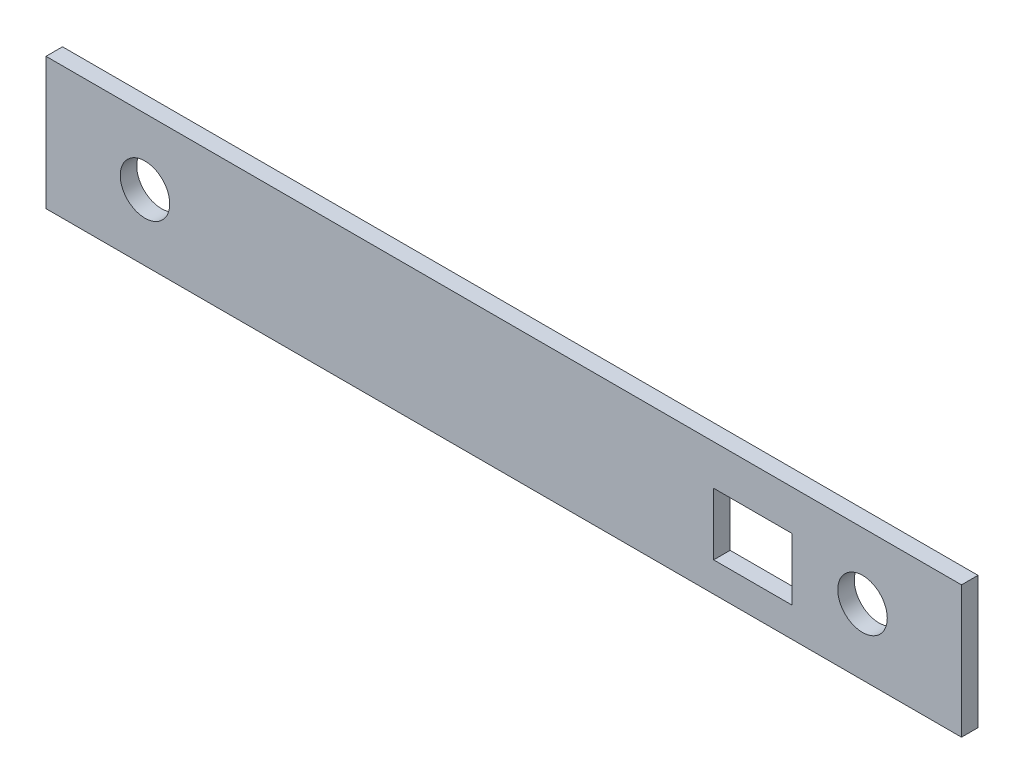
ISO-10303-21;
HEADER;
FILE_DESCRIPTION(('STEP AP214'),'2;1');
FILE_NAME('part.step','',(''),(''),'','','');
FILE_SCHEMA(('AUTOMOTIVE_DESIGN { 1 0 10303 214 1 1 1 1 }'));
ENDSEC;
DATA;
#1=APPLICATION_CONTEXT('core data for automotive mechanical design processes');
#2=APPLICATION_PROTOCOL_DEFINITION('international standard','automotive_design',2000,#1);
#3=PRODUCT_CONTEXT('',#1,'mechanical');
#4=PRODUCT('Part','Part','',(#3));
#5=PRODUCT_RELATED_PRODUCT_CATEGORY('part','',(#4));
#6=PRODUCT_DEFINITION_FORMATION('','',#4);
#7=PRODUCT_DEFINITION_CONTEXT('part definition',#1,'design');
#8=PRODUCT_DEFINITION('design','',#6,#7);
#9=PRODUCT_DEFINITION_SHAPE('','',#8);
#10=(LENGTH_UNIT() NAMED_UNIT(*) SI_UNIT(.MILLI.,.METRE.));
#11=(NAMED_UNIT(*) PLANE_ANGLE_UNIT() SI_UNIT($,.RADIAN.));
#12=(NAMED_UNIT(*) SI_UNIT($,.STERADIAN.) SOLID_ANGLE_UNIT());
#13=UNCERTAINTY_MEASURE_WITH_UNIT(LENGTH_MEASURE(1.E-05),#10,'distance_accuracy_value','');
#14=(GEOMETRIC_REPRESENTATION_CONTEXT(3) GLOBAL_UNCERTAINTY_ASSIGNED_CONTEXT((#13)) GLOBAL_UNIT_ASSIGNED_CONTEXT((#10,
#11,#12)) REPRESENTATION_CONTEXT('',''));
#15=CARTESIAN_POINT('',(0.,0.,0.));
#16=DIRECTION('',(0.,0.,1.));
#17=DIRECTION('',(1.,0.,0.));
#18=AXIS2_PLACEMENT_3D('',#15,#16,#17);
#19=CARTESIAN_POINT('',(0.,50.8,6.35));
#20=DIRECTION('',(0.,0.,-1.));
#21=DIRECTION('',(-1.,0.,0.));
#22=AXIS2_PLACEMENT_3D('',#19,#20,#21);
#23=PLANE('',#22);
#24=CARTESIAN_POINT('',(314.325,25.4,6.35));
#25=DIRECTION('',(0.,0.,1.));
#26=DIRECTION('',(1.,0.,0.));
#27=AXIS2_PLACEMENT_3D('',#24,#25,#26);
#28=CIRCLE('',#27,9.52500000000002);
#29=CARTESIAN_POINT('',(323.85,25.4,6.35));
#30=VERTEX_POINT('',#29);
#31=EDGE_CURVE('E135',#30,#30,#28,.T.);
#32=ORIENTED_EDGE('',*,*,#31,.F.);
#33=EDGE_LOOP('',(#32));
#34=FACE_BOUND('',#33,.T.);
#35=DIRECTION('',(0.,-1.,0.));
#36=VECTOR('',#35,1.);
#37=CARTESIAN_POINT('',(0.,0.,6.35));
#38=LINE('',#37,#36);
#39=CARTESIAN_POINT('',(0.,50.8,6.35));
#40=VERTEX_POINT('',#39);
#41=CARTESIAN_POINT('',(0.,0.,6.35));
#42=VERTEX_POINT('',#41);
#43=EDGE_CURVE('E147',#40,#42,#38,.T.);
#44=ORIENTED_EDGE('',*,*,#43,.T.);
#45=DIRECTION('',(1.,0.,0.));
#46=VECTOR('',#45,1.);
#47=CARTESIAN_POINT('',(0.,0.,6.35));
#48=LINE('',#47,#46);
#49=CARTESIAN_POINT('',(352.425,0.,6.35));
#50=VERTEX_POINT('',#49);
#51=EDGE_CURVE('E150',#42,#50,#48,.T.);
#52=ORIENTED_EDGE('',*,*,#51,.T.);
#53=DIRECTION('',(0.,1.,0.));
#54=VECTOR('',#53,1.);
#55=CARTESIAN_POINT('',(352.425,0.,6.35));
#56=LINE('',#55,#54);
#57=CARTESIAN_POINT('',(352.425,50.8,6.35));
#58=VERTEX_POINT('',#57);
#59=EDGE_CURVE('E153',#50,#58,#56,.T.);
#60=ORIENTED_EDGE('',*,*,#59,.T.);
#61=DIRECTION('',(-1.,0.,0.));
#62=VECTOR('',#61,1.);
#63=CARTESIAN_POINT('',(0.,50.8,6.35));
#64=LINE('',#63,#62);
#65=EDGE_CURVE('E155',#58,#40,#64,.T.);
#66=ORIENTED_EDGE('',*,*,#65,.T.);
#67=EDGE_LOOP('',(#44,#52,#60,#66));
#68=FACE_BOUND('',#67,.T.);
#69=CARTESIAN_POINT('',(38.1,25.4,6.35));
#70=DIRECTION('',(0.,0.,1.));
#71=DIRECTION('',(1.,0.,0.));
#72=AXIS2_PLACEMENT_3D('',#69,#70,#71);
#73=CIRCLE('',#72,9.525);
#74=CARTESIAN_POINT('',(47.625,25.4,6.35));
#75=VERTEX_POINT('',#74);
#76=EDGE_CURVE('E141',#75,#75,#73,.T.);
#77=ORIENTED_EDGE('',*,*,#76,.F.);
#78=EDGE_LOOP('',(#77));
#79=FACE_BOUND('',#78,.T.);
#80=DIRECTION('',(0.,-1.,0.));
#81=VECTOR('',#80,1.);
#82=CARTESIAN_POINT('',(257.006385068706,11.4236068868649,6.35));
#83=LINE('',#82,#81);
#84=CARTESIAN_POINT('',(257.006385068706,35.3058395317783,6.35));
#85=VERTEX_POINT('',#84);
#86=CARTESIAN_POINT('',(257.006385068706,11.4236068868649,6.35));
#87=VERTEX_POINT('',#86);
#88=EDGE_CURVE('E97',#85,#87,#83,.T.);
#89=ORIENTED_EDGE('',*,*,#88,.F.);
#90=DIRECTION('',(-1.,0.,0.));
#91=VECTOR('',#90,1.);
#92=CARTESIAN_POINT('',(257.006385068706,35.3058395317783,6.35));
#93=LINE('',#92,#91);
#94=CARTESIAN_POINT('',(287.152195208236,35.3058395317783,6.35));
#95=VERTEX_POINT('',#94);
#96=EDGE_CURVE('E119',#95,#85,#93,.T.);
#97=ORIENTED_EDGE('',*,*,#96,.F.);
#98=DIRECTION('',(0.,1.,0.));
#99=VECTOR('',#98,1.);
#100=CARTESIAN_POINT('',(287.152195208236,11.4236068868649,6.35));
#101=LINE('',#100,#99);
#102=CARTESIAN_POINT('',(287.152195208236,11.4236068868649,6.35));
#103=VERTEX_POINT('',#102);
#104=EDGE_CURVE('E117',#103,#95,#101,.T.);
#105=ORIENTED_EDGE('',*,*,#104,.F.);
#106=DIRECTION('',(1.,0.,0.));
#107=VECTOR('',#106,1.);
#108=CARTESIAN_POINT('',(257.006385068706,11.4236068868649,6.35));
#109=LINE('',#108,#107);
#110=EDGE_CURVE('E105',#87,#103,#109,.T.);
#111=ORIENTED_EDGE('',*,*,#110,.F.);
#112=EDGE_LOOP('',(#89,#97,#105,#111));
#113=FACE_BOUND('',#112,.T.);
#114=ADVANCED_FACE('F32',(#34,#68,#79,#113),#23,.F.);
#115=CARTESIAN_POINT('',(0.,50.8,0.));
#116=DIRECTION('',(0.,0.,-1.));
#117=DIRECTION('',(-1.,0.,0.));
#118=AXIS2_PLACEMENT_3D('',#115,#116,#117);
#119=PLANE('',#118);
#120=CARTESIAN_POINT('',(314.325,25.4,0.));
#121=DIRECTION('',(0.,0.,1.));
#122=DIRECTION('',(1.,0.,0.));
#123=AXIS2_PLACEMENT_3D('',#120,#121,#122);
#124=CIRCLE('',#123,9.52500000000002);
#125=CARTESIAN_POINT('',(323.85,25.4,0.));
#126=VERTEX_POINT('',#125);
#127=EDGE_CURVE('E113',#126,#126,#124,.T.);
#128=ORIENTED_EDGE('',*,*,#127,.T.);
#129=EDGE_LOOP('',(#128));
#130=FACE_BOUND('',#129,.T.);
#131=DIRECTION('',(0.,-1.,0.));
#132=VECTOR('',#131,1.);
#133=CARTESIAN_POINT('',(0.,0.,0.));
#134=LINE('',#133,#132);
#135=CARTESIAN_POINT('',(0.,50.8,0.));
#136=VERTEX_POINT('',#135);
#137=CARTESIAN_POINT('',(0.,0.,0.));
#138=VERTEX_POINT('',#137);
#139=EDGE_CURVE('E144',#136,#138,#134,.T.);
#140=ORIENTED_EDGE('',*,*,#139,.F.);
#141=DIRECTION('',(-1.,0.,0.));
#142=VECTOR('',#141,1.);
#143=CARTESIAN_POINT('',(0.,50.8,0.));
#144=LINE('',#143,#142);
#145=CARTESIAN_POINT('',(352.425,50.8,0.));
#146=VERTEX_POINT('',#145);
#147=EDGE_CURVE('E151',#146,#136,#144,.T.);
#148=ORIENTED_EDGE('',*,*,#147,.F.);
#149=DIRECTION('',(0.,1.,0.));
#150=VECTOR('',#149,1.);
#151=CARTESIAN_POINT('',(352.425,0.,0.));
#152=LINE('',#151,#150);
#153=CARTESIAN_POINT('',(352.425,0.,0.));
#154=VERTEX_POINT('',#153);
#155=EDGE_CURVE('E162',#154,#146,#152,.T.);
#156=ORIENTED_EDGE('',*,*,#155,.F.);
#157=DIRECTION('',(1.,0.,0.));
#158=VECTOR('',#157,1.);
#159=CARTESIAN_POINT('',(0.,0.,0.));
#160=LINE('',#159,#158);
#161=EDGE_CURVE('E160',#138,#154,#160,.T.);
#162=ORIENTED_EDGE('',*,*,#161,.F.);
#163=EDGE_LOOP('',(#140,#148,#156,#162));
#164=FACE_BOUND('',#163,.T.);
#165=CARTESIAN_POINT('',(38.1,25.4,0.));
#166=DIRECTION('',(0.,0.,1.));
#167=DIRECTION('',(1.,0.,0.));
#168=AXIS2_PLACEMENT_3D('',#165,#166,#167);
#169=CIRCLE('',#168,9.525);
#170=CARTESIAN_POINT('',(47.625,25.4,0.));
#171=VERTEX_POINT('',#170);
#172=EDGE_CURVE('E138',#171,#171,#169,.T.);
#173=ORIENTED_EDGE('',*,*,#172,.T.);
#174=EDGE_LOOP('',(#173));
#175=FACE_BOUND('',#174,.T.);
#176=DIRECTION('',(-1.,0.,0.));
#177=VECTOR('',#176,1.);
#178=CARTESIAN_POINT('',(257.006385068706,35.3058395317783,0.));
#179=LINE('',#178,#177);
#180=CARTESIAN_POINT('',(287.152195208236,35.3058395317783,0.));
#181=VERTEX_POINT('',#180);
#182=CARTESIAN_POINT('',(257.006385068706,35.3058395317783,0.));
#183=VERTEX_POINT('',#182);
#184=EDGE_CURVE('E106',#181,#183,#179,.T.);
#185=ORIENTED_EDGE('',*,*,#184,.T.);
#186=DIRECTION('',(0.,-1.,0.));
#187=VECTOR('',#186,1.);
#188=CARTESIAN_POINT('',(257.006385068706,11.4236068868649,0.));
#189=LINE('',#188,#187);
#190=CARTESIAN_POINT('',(257.006385068706,11.4236068868649,0.));
#191=VERTEX_POINT('',#190);
#192=EDGE_CURVE('E55',#183,#191,#189,.T.);
#193=ORIENTED_EDGE('',*,*,#192,.T.);
#194=DIRECTION('',(1.,0.,0.));
#195=VECTOR('',#194,1.);
#196=CARTESIAN_POINT('',(257.006385068706,11.4236068868649,0.));
#197=LINE('',#196,#195);
#198=CARTESIAN_POINT('',(287.152195208236,11.4236068868649,0.));
#199=VERTEX_POINT('',#198);
#200=EDGE_CURVE('E112',#191,#199,#197,.T.);
#201=ORIENTED_EDGE('',*,*,#200,.T.);
#202=DIRECTION('',(0.,1.,0.));
#203=VECTOR('',#202,1.);
#204=CARTESIAN_POINT('',(287.152195208236,11.4236068868649,0.));
#205=LINE('',#204,#203);
#206=EDGE_CURVE('E127',#199,#181,#205,.T.);
#207=ORIENTED_EDGE('',*,*,#206,.T.);
#208=EDGE_LOOP('',(#185,#193,#201,#207));
#209=FACE_BOUND('',#208,.T.);
#210=ADVANCED_FACE('F180',(#130,#164,#175,#209),#119,.T.);
#211=CARTESIAN_POINT('',(0.,0.,6.35));
#212=DIRECTION('',(1.,0.,0.));
#213=DIRECTION('',(0.,0.,-1.));
#214=AXIS2_PLACEMENT_3D('',#211,#212,#213);
#215=PLANE('',#214);
#216=ORIENTED_EDGE('',*,*,#139,.T.);
#217=DIRECTION('',(0.,0.,-1.));
#218=VECTOR('',#217,1.);
#219=CARTESIAN_POINT('',(0.,0.,6.35));
#220=LINE('',#219,#218);
#221=EDGE_CURVE('E11',#42,#138,#220,.T.);
#222=ORIENTED_EDGE('',*,*,#221,.F.);
#223=ORIENTED_EDGE('',*,*,#43,.F.);
#224=DIRECTION('',(0.,0.,-1.));
#225=VECTOR('',#224,1.);
#226=CARTESIAN_POINT('',(0.,50.8,6.35));
#227=LINE('',#226,#225);
#228=EDGE_CURVE('E157',#40,#136,#227,.T.);
#229=ORIENTED_EDGE('',*,*,#228,.T.);
#230=EDGE_LOOP('',(#216,#222,#223,#229));
#231=FACE_BOUND('',#230,.T.);
#232=ADVANCED_FACE('F34',(#231),#215,.F.);
#233=CARTESIAN_POINT('',(0.,0.,6.35));
#234=DIRECTION('',(0.,1.,0.));
#235=DIRECTION('',(0.,0.,1.));
#236=AXIS2_PLACEMENT_3D('',#233,#234,#235);
#237=PLANE('',#236);
#238=CARTESIAN_POINT('',(238.759223146516,0.,3.17499999999952));
#239=DIRECTION('',(0.,-1.,0.));
#240=DIRECTION('',(0.,0.,-1.));
#241=AXIS2_PLACEMENT_3D('',#238,#239,#240);
#242=CIRCLE('',#241,1.77623101182901);
#243=CARTESIAN_POINT('',(238.759223146516,0.,1.39876898817052));
#244=VERTEX_POINT('',#243);
#245=EDGE_CURVE('E289',#244,#244,#242,.T.);
#246=ORIENTED_EDGE('',*,*,#245,.F.);
#247=EDGE_LOOP('',(#246));
#248=FACE_BOUND('',#247,.T.);
#249=ORIENTED_EDGE('',*,*,#161,.T.);
#250=DIRECTION('',(0.,0.,-1.));
#251=VECTOR('',#250,1.);
#252=CARTESIAN_POINT('',(352.425,0.,6.35));
#253=LINE('',#252,#251);
#254=EDGE_CURVE('E40',#50,#154,#253,.T.);
#255=ORIENTED_EDGE('',*,*,#254,.F.);
#256=ORIENTED_EDGE('',*,*,#51,.F.);
#257=ORIENTED_EDGE('',*,*,#221,.T.);
#258=EDGE_LOOP('',(#249,#255,#256,#257));
#259=FACE_BOUND('',#258,.T.);
#260=ADVANCED_FACE('F191',(#248,#259),#237,.F.);
#261=CARTESIAN_POINT('',(352.425,0.,6.35));
#262=DIRECTION('',(-1.,0.,0.));
#263=DIRECTION('',(0.,0.,1.));
#264=AXIS2_PLACEMENT_3D('',#261,#262,#263);
#265=PLANE('',#264);
#266=ORIENTED_EDGE('',*,*,#155,.T.);
#267=DIRECTION('',(0.,0.,-1.));
#268=VECTOR('',#267,1.);
#269=CARTESIAN_POINT('',(352.425,50.8,6.35));
#270=LINE('',#269,#268);
#271=EDGE_CURVE('E167',#58,#146,#270,.T.);
#272=ORIENTED_EDGE('',*,*,#271,.F.);
#273=ORIENTED_EDGE('',*,*,#59,.F.);
#274=ORIENTED_EDGE('',*,*,#254,.T.);
#275=EDGE_LOOP('',(#266,#272,#273,#274));
#276=FACE_BOUND('',#275,.T.);
#277=ADVANCED_FACE('F174',(#276),#265,.F.);
#278=CARTESIAN_POINT('',(0.,50.8,6.35));
#279=DIRECTION('',(0.,-1.,0.));
#280=DIRECTION('',(0.,0.,-1.));
#281=AXIS2_PLACEMENT_3D('',#278,#279,#280);
#282=PLANE('',#281);
#283=ORIENTED_EDGE('',*,*,#147,.T.);
#284=ORIENTED_EDGE('',*,*,#228,.F.);
#285=ORIENTED_EDGE('',*,*,#65,.F.);
#286=ORIENTED_EDGE('',*,*,#271,.T.);
#287=EDGE_LOOP('',(#283,#284,#285,#286));
#288=FACE_BOUND('',#287,.T.);
#289=ADVANCED_FACE('F184',(#288),#282,.F.);
#290=CARTESIAN_POINT('',(38.1,25.4,6.35));
#291=DIRECTION('',(0.,0.,-1.));
#292=DIRECTION('',(-1.,0.,0.));
#293=AXIS2_PLACEMENT_3D('',#290,#291,#292);
#294=CYLINDRICAL_SURFACE('',#293,9.525);
#295=ORIENTED_EDGE('',*,*,#76,.T.);
#296=EDGE_LOOP('',(#295));
#297=FACE_BOUND('',#296,.T.);
#298=ORIENTED_EDGE('',*,*,#172,.F.);
#299=EDGE_LOOP('',(#298));
#300=FACE_BOUND('',#299,.T.);
#301=ADVANCED_FACE('F210',(#297,#300),#294,.F.);
#302=CARTESIAN_POINT('',(314.325,25.4,6.35));
#303=DIRECTION('',(0.,0.,-1.));
#304=DIRECTION('',(-1.,0.,0.));
#305=AXIS2_PLACEMENT_3D('',#302,#303,#304);
#306=CYLINDRICAL_SURFACE('',#305,9.52500000000002);
#307=ORIENTED_EDGE('',*,*,#31,.T.);
#308=EDGE_LOOP('',(#307));
#309=FACE_BOUND('',#308,.T.);
#310=ORIENTED_EDGE('',*,*,#127,.F.);
#311=EDGE_LOOP('',(#310));
#312=FACE_BOUND('',#311,.T.);
#313=ADVANCED_FACE('F217',(#309,#312),#306,.F.);
#314=CARTESIAN_POINT('',(257.006385068706,11.4236068868649,6.35));
#315=DIRECTION('',(1.,0.,0.));
#316=DIRECTION('',(0.,0.,-1.));
#317=AXIS2_PLACEMENT_3D('',#314,#315,#316);
#318=PLANE('',#317);
#319=ORIENTED_EDGE('',*,*,#192,.F.);
#320=DIRECTION('',(0.,0.,-1.));
#321=VECTOR('',#320,1.);
#322=CARTESIAN_POINT('',(257.006385068706,35.3058395317783,6.35));
#323=LINE('',#322,#321);
#324=EDGE_CURVE('E101',#85,#183,#323,.T.);
#325=ORIENTED_EDGE('',*,*,#324,.F.);
#326=ORIENTED_EDGE('',*,*,#88,.T.);
#327=DIRECTION('',(0.,0.,-1.));
#328=VECTOR('',#327,1.);
#329=CARTESIAN_POINT('',(257.006385068706,11.4236068868649,6.35));
#330=LINE('',#329,#328);
#331=EDGE_CURVE('E100',#87,#191,#330,.T.);
#332=ORIENTED_EDGE('',*,*,#331,.T.);
#333=EDGE_LOOP('',(#319,#325,#326,#332));
#334=FACE_BOUND('',#333,.T.);
#335=ADVANCED_FACE('F99',(#334),#318,.T.);
#336=CARTESIAN_POINT('',(257.006385068706,11.4236068868649,6.35));
#337=DIRECTION('',(0.,1.,0.));
#338=DIRECTION('',(0.,0.,1.));
#339=AXIS2_PLACEMENT_3D('',#336,#337,#338);
#340=PLANE('',#339);
#341=ORIENTED_EDGE('',*,*,#200,.F.);
#342=ORIENTED_EDGE('',*,*,#331,.F.);
#343=ORIENTED_EDGE('',*,*,#110,.T.);
#344=DIRECTION('',(0.,0.,-1.));
#345=VECTOR('',#344,1.);
#346=CARTESIAN_POINT('',(287.152195208236,11.4236068868649,6.35));
#347=LINE('',#346,#345);
#348=EDGE_CURVE('E114',#103,#199,#347,.T.);
#349=ORIENTED_EDGE('',*,*,#348,.T.);
#350=EDGE_LOOP('',(#341,#342,#343,#349));
#351=FACE_BOUND('',#350,.T.);
#352=ADVANCED_FACE('F109',(#351),#340,.T.);
#353=CARTESIAN_POINT('',(287.152195208236,11.4236068868649,6.35));
#354=DIRECTION('',(-1.,0.,0.));
#355=DIRECTION('',(0.,0.,1.));
#356=AXIS2_PLACEMENT_3D('',#353,#354,#355);
#357=PLANE('',#356);
#358=ORIENTED_EDGE('',*,*,#206,.F.);
#359=ORIENTED_EDGE('',*,*,#348,.F.);
#360=ORIENTED_EDGE('',*,*,#104,.T.);
#361=DIRECTION('',(0.,0.,-1.));
#362=VECTOR('',#361,1.);
#363=CARTESIAN_POINT('',(287.152195208236,35.3058395317783,6.35));
#364=LINE('',#363,#362);
#365=EDGE_CURVE('E47',#95,#181,#364,.T.);
#366=ORIENTED_EDGE('',*,*,#365,.T.);
#367=EDGE_LOOP('',(#358,#359,#360,#366));
#368=FACE_BOUND('',#367,.T.);
#369=ADVANCED_FACE('F231',(#368),#357,.T.);
#370=CARTESIAN_POINT('',(257.006385068706,35.3058395317783,6.35));
#371=DIRECTION('',(0.,-1.,0.));
#372=DIRECTION('',(0.,0.,-1.));
#373=AXIS2_PLACEMENT_3D('',#370,#371,#372);
#374=PLANE('',#373);
#375=ORIENTED_EDGE('',*,*,#184,.F.);
#376=ORIENTED_EDGE('',*,*,#365,.F.);
#377=ORIENTED_EDGE('',*,*,#96,.T.);
#378=ORIENTED_EDGE('',*,*,#324,.T.);
#379=EDGE_LOOP('',(#375,#376,#377,#378));
#380=FACE_BOUND('',#379,.T.);
#381=ADVANCED_FACE('F228',(#380),#374,.T.);
#382=CARTESIAN_POINT('',(238.759223146516,19.304,3.17499999999952));
#383=DIRECTION('',(0.,-1.,0.));
#384=DIRECTION('',(0.,0.,-1.));
#385=AXIS2_PLACEMENT_3D('',#382,#383,#384);
#386=CYLINDRICAL_SURFACE('',#385,1.77623101182901);
#387=CARTESIAN_POINT('',(238.759223146516,19.304,3.17499999999952));
#388=DIRECTION('',(0.,-1.,0.));
#389=DIRECTION('',(0.,0.,-1.));
#390=AXIS2_PLACEMENT_3D('',#387,#388,#389);
#391=CIRCLE('',#390,1.77623101182901);
#392=CARTESIAN_POINT('',(238.759223146516,19.304,1.39876898817052));
#393=VERTEX_POINT('',#392);
#394=EDGE_CURVE('E125',#393,#393,#391,.T.);
#395=ORIENTED_EDGE('',*,*,#394,.F.);
#396=EDGE_LOOP('',(#395));
#397=FACE_BOUND('',#396,.T.);
#398=ORIENTED_EDGE('',*,*,#245,.T.);
#399=EDGE_LOOP('',(#398));
#400=FACE_BOUND('',#399,.T.);
#401=ADVANCED_FACE('F230',(#397,#400),#386,.F.);
#402=CARTESIAN_POINT('',(238.759223146516,19.304,3.17499999999952));
#403=DIRECTION('',(0.,-1.,0.));
#404=DIRECTION('',(0.,0.,-1.));
#405=AXIS2_PLACEMENT_3D('',#402,#403,#404);
#406=PLANE('',#405);
#407=ORIENTED_EDGE('',*,*,#394,.T.);
#408=EDGE_LOOP('',(#407));
#409=FACE_BOUND('',#408,.T.);
#410=ADVANCED_FACE('F237',(#409),#406,.T.);
#411=CLOSED_SHELL('',(#114,#210,#232,#260,#277,#289,#301,#313,#335,#352,#369,#381,#401,#410));
#412=MANIFOLD_SOLID_BREP('B2',#411);
#413=ADVANCED_BREP_SHAPE_REPRESENTATION('',(#18,#412),#14);
#414=SHAPE_DEFINITION_REPRESENTATION(#9,#413);
ENDSEC;
END-ISO-10303-21;
